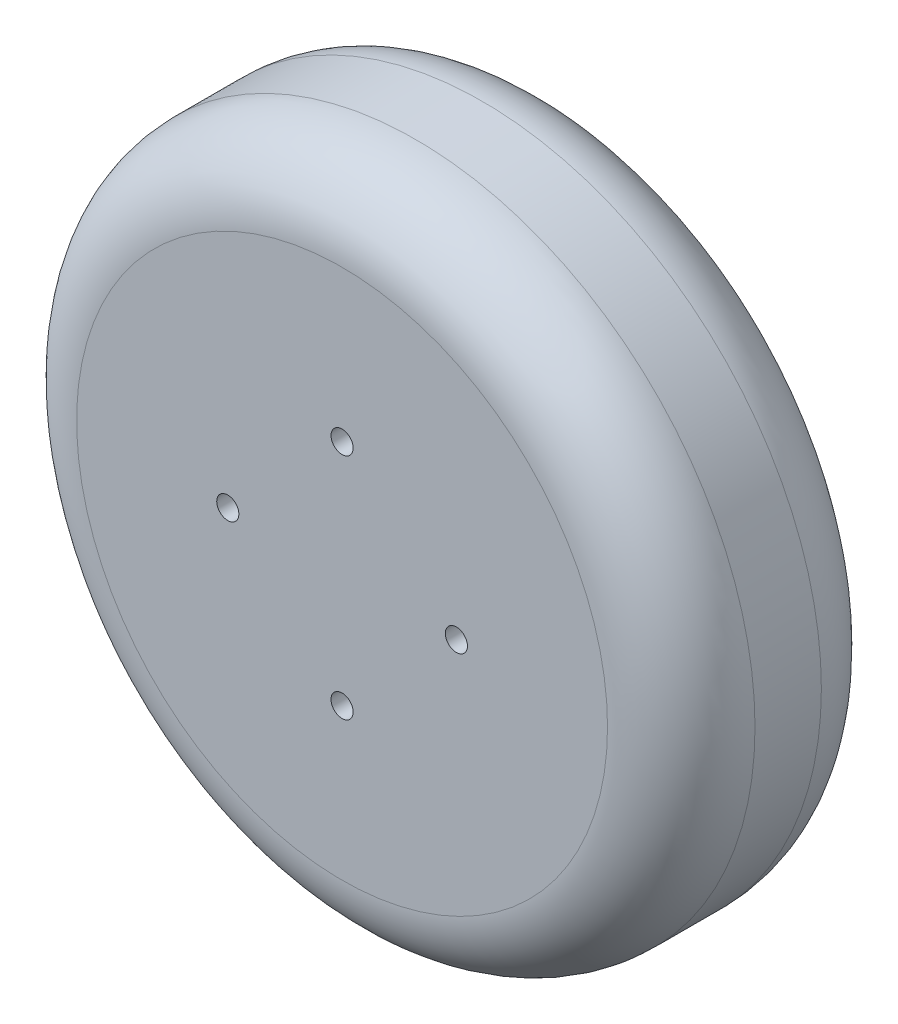
ISO-10303-21;
HEADER;
FILE_DESCRIPTION(('STEP AP214'),'2;1');
FILE_NAME('part.step','',(''),(''),'','','');
FILE_SCHEMA(('AUTOMOTIVE_DESIGN { 1 0 10303 214 1 1 1 1 }'));
ENDSEC;
DATA;
#1=APPLICATION_CONTEXT('core data for automotive mechanical design processes');
#2=APPLICATION_PROTOCOL_DEFINITION('international standard','automotive_design',2000,#1);
#3=PRODUCT_CONTEXT('',#1,'mechanical');
#4=PRODUCT('Part','Part','',(#3));
#5=PRODUCT_RELATED_PRODUCT_CATEGORY('part','',(#4));
#6=PRODUCT_DEFINITION_FORMATION('','',#4);
#7=PRODUCT_DEFINITION_CONTEXT('part definition',#1,'design');
#8=PRODUCT_DEFINITION('design','',#6,#7);
#9=PRODUCT_DEFINITION_SHAPE('','',#8);
#10=(LENGTH_UNIT() NAMED_UNIT(*) SI_UNIT(.MILLI.,.METRE.));
#11=(NAMED_UNIT(*) PLANE_ANGLE_UNIT() SI_UNIT($,.RADIAN.));
#12=(NAMED_UNIT(*) SI_UNIT($,.STERADIAN.) SOLID_ANGLE_UNIT());
#13=UNCERTAINTY_MEASURE_WITH_UNIT(LENGTH_MEASURE(1.E-05),#10,'distance_accuracy_value','');
#14=(GEOMETRIC_REPRESENTATION_CONTEXT(3) GLOBAL_UNCERTAINTY_ASSIGNED_CONTEXT((#13)) GLOBAL_UNIT_ASSIGNED_CONTEXT((#10,
#11,#12)) REPRESENTATION_CONTEXT('',''));
#15=CARTESIAN_POINT('',(0.,0.,0.));
#16=DIRECTION('',(0.,0.,1.));
#17=DIRECTION('',(1.,0.,0.));
#18=AXIS2_PLACEMENT_3D('',#15,#16,#17);
#19=CARTESIAN_POINT('',(0.,0.,29.));
#20=DIRECTION('',(0.,0.,1.));
#21=DIRECTION('',(1.,0.,0.));
#22=AXIS2_PLACEMENT_3D('',#19,#20,#21);
#23=PLANE('',#22);
#24=CARTESIAN_POINT('',(0.,0.,29.));
#25=DIRECTION('',(0.,0.,1.));
#26=DIRECTION('',(1.,0.,0.));
#27=AXIS2_PLACEMENT_3D('',#24,#25,#26);
#28=CIRCLE('',#27,36.);
#29=CARTESIAN_POINT('',(36.,0.,29.));
#30=VERTEX_POINT('',#29);
#31=EDGE_CURVE('E54',#30,#30,#28,.T.);
#32=ORIENTED_EDGE('',*,*,#31,.T.);
#33=EDGE_LOOP('',(#32));
#34=FACE_BOUND('',#33,.T.);
#35=CARTESIAN_POINT('',(1.08235921504137E-13,15.5,29.));
#36=DIRECTION('',(0.,0.,1.));
#37=DIRECTION('',(1.,0.,0.));
#38=AXIS2_PLACEMENT_3D('',#35,#36,#37);
#39=CIRCLE('',#38,1.5);
#40=CARTESIAN_POINT('',(-1.49999999999989,15.5,29.));
#41=VERTEX_POINT('',#40);
#42=EDGE_CURVE('E73',#41,#41,#39,.T.);
#43=ORIENTED_EDGE('',*,*,#42,.F.);
#44=EDGE_LOOP('',(#43));
#45=FACE_BOUND('',#44,.T.);
#46=CARTESIAN_POINT('',(0.,-15.5,29.));
#47=DIRECTION('',(0.,0.,1.));
#48=DIRECTION('',(1.,0.,0.));
#49=AXIS2_PLACEMENT_3D('',#46,#47,#48);
#50=CIRCLE('',#49,1.5);
#51=CARTESIAN_POINT('',(-1.5,-15.5,29.));
#52=VERTEX_POINT('',#51);
#53=EDGE_CURVE('E60',#52,#52,#50,.T.);
#54=ORIENTED_EDGE('',*,*,#53,.F.);
#55=EDGE_LOOP('',(#54));
#56=FACE_BOUND('',#55,.T.);
#57=CARTESIAN_POINT('',(-15.5,0.,29.));
#58=DIRECTION('',(0.,0.,1.));
#59=DIRECTION('',(1.,0.,0.));
#60=AXIS2_PLACEMENT_3D('',#57,#58,#59);
#61=CIRCLE('',#60,1.5);
#62=CARTESIAN_POINT('',(-17.,0.,29.));
#63=VERTEX_POINT('',#62);
#64=EDGE_CURVE('E65',#63,#63,#61,.T.);
#65=ORIENTED_EDGE('',*,*,#64,.F.);
#66=EDGE_LOOP('',(#65));
#67=FACE_BOUND('',#66,.T.);
#68=CARTESIAN_POINT('',(15.5,-1.62353882256206E-13,29.));
#69=DIRECTION('',(0.,0.,1.));
#70=DIRECTION('',(1.,0.,0.));
#71=AXIS2_PLACEMENT_3D('',#68,#69,#70);
#72=CIRCLE('',#71,1.5);
#73=CARTESIAN_POINT('',(14.,-1.62353882256206E-13,29.));
#74=VERTEX_POINT('',#73);
#75=EDGE_CURVE('E81',#74,#74,#72,.T.);
#76=ORIENTED_EDGE('',*,*,#75,.F.);
#77=EDGE_LOOP('',(#76));
#78=FACE_BOUND('',#77,.T.);
#79=ADVANCED_FACE('F36',(#34,#45,#56,#67,#78),#23,.T.);
#80=CARTESIAN_POINT('',(0.,0.,0.));
#81=DIRECTION('',(0.,0.,1.));
#82=DIRECTION('',(1.,0.,0.));
#83=AXIS2_PLACEMENT_3D('',#80,#81,#82);
#84=PLANE('',#83);
#85=CARTESIAN_POINT('',(0.,0.,0.));
#86=DIRECTION('',(0.,0.,1.));
#87=DIRECTION('',(1.,0.,0.));
#88=AXIS2_PLACEMENT_3D('',#85,#86,#87);
#89=CIRCLE('',#88,36.);
#90=CARTESIAN_POINT('',(36.,0.,0.));
#91=VERTEX_POINT('',#90);
#92=EDGE_CURVE('E10',#91,#91,#89,.F.);
#93=ORIENTED_EDGE('',*,*,#92,.T.);
#94=EDGE_LOOP('',(#93));
#95=FACE_BOUND('',#94,.T.);
#96=CARTESIAN_POINT('',(0.,-15.5,0.));
#97=DIRECTION('',(0.,0.,1.));
#98=DIRECTION('',(1.,0.,0.));
#99=AXIS2_PLACEMENT_3D('',#96,#97,#98);
#100=CIRCLE('',#99,1.5);
#101=CARTESIAN_POINT('',(-1.5,-15.5,0.));
#102=VERTEX_POINT('',#101);
#103=EDGE_CURVE('E61',#102,#102,#100,.T.);
#104=ORIENTED_EDGE('',*,*,#103,.T.);
#105=EDGE_LOOP('',(#104));
#106=FACE_BOUND('',#105,.T.);
#107=CARTESIAN_POINT('',(-15.5,0.,0.));
#108=DIRECTION('',(0.,0.,1.));
#109=DIRECTION('',(1.,0.,0.));
#110=AXIS2_PLACEMENT_3D('',#107,#108,#109);
#111=CIRCLE('',#110,1.5);
#112=CARTESIAN_POINT('',(-17.,0.,0.));
#113=VERTEX_POINT('',#112);
#114=EDGE_CURVE('E69',#113,#113,#111,.T.);
#115=ORIENTED_EDGE('',*,*,#114,.T.);
#116=EDGE_LOOP('',(#115));
#117=FACE_BOUND('',#116,.T.);
#118=CARTESIAN_POINT('',(1.08235921504137E-13,15.5,0.));
#119=DIRECTION('',(0.,0.,1.));
#120=DIRECTION('',(1.,0.,0.));
#121=AXIS2_PLACEMENT_3D('',#118,#119,#120);
#122=CIRCLE('',#121,1.5);
#123=CARTESIAN_POINT('',(-1.49999999999989,15.5,0.));
#124=VERTEX_POINT('',#123);
#125=EDGE_CURVE('E77',#124,#124,#122,.T.);
#126=ORIENTED_EDGE('',*,*,#125,.T.);
#127=EDGE_LOOP('',(#126));
#128=FACE_BOUND('',#127,.T.);
#129=CARTESIAN_POINT('',(15.5,-1.62353882256206E-13,0.));
#130=DIRECTION('',(0.,0.,1.));
#131=DIRECTION('',(1.,0.,0.));
#132=AXIS2_PLACEMENT_3D('',#129,#130,#131);
#133=CIRCLE('',#132,1.5);
#134=CARTESIAN_POINT('',(14.,-1.62353882256206E-13,0.));
#135=VERTEX_POINT('',#134);
#136=EDGE_CURVE('E85',#135,#135,#133,.T.);
#137=ORIENTED_EDGE('',*,*,#136,.T.);
#138=EDGE_LOOP('',(#137));
#139=FACE_BOUND('',#138,.T.);
#140=ADVANCED_FACE('F97',(#95,#106,#117,#128,#139),#84,.F.);
#141=CARTESIAN_POINT('',(0.,0.,29.));
#142=DIRECTION('',(0.,0.,-1.));
#143=DIRECTION('',(-1.,0.,0.));
#144=AXIS2_PLACEMENT_3D('',#141,#142,#143);
#145=CYLINDRICAL_SURFACE('',#144,46.);
#146=CARTESIAN_POINT('',(0.,0.,10.));
#147=DIRECTION('',(0.,0.,1.));
#148=DIRECTION('',(1.,0.,0.));
#149=AXIS2_PLACEMENT_3D('',#146,#147,#148);
#150=CIRCLE('',#149,46.);
#151=CARTESIAN_POINT('',(-46.,0.,9.99999999999999));
#152=VERTEX_POINT('',#151);
#153=EDGE_CURVE('E44',#152,#152,#150,.T.);
#154=CARTESIAN_POINT('',(0.,0.,19.));
#155=DIRECTION('',(0.,0.,1.));
#156=DIRECTION('',(1.,0.,0.));
#157=AXIS2_PLACEMENT_3D('',#154,#155,#156);
#158=CIRCLE('',#157,46.);
#159=CARTESIAN_POINT('',(-46.,0.,19.));
#160=VERTEX_POINT('',#159);
#161=EDGE_CURVE('E49',#160,#160,#158,.F.);
#162=CARTESIAN_POINT('',(-46.,0.,9.99999999999999));
#163=CARTESIAN_POINT('',(-46.,0.,10.09375));
#164=CARTESIAN_POINT('',(-46.,0.,10.1875));
#165=CARTESIAN_POINT('',(-46.,0.,10.375));
#166=CARTESIAN_POINT('',(-46.,0.,10.46875));
#167=CARTESIAN_POINT('',(-46.,0.,10.65625));
#168=CARTESIAN_POINT('',(-46.,0.,10.75));
#169=CARTESIAN_POINT('',(-46.,0.,10.9375));
#170=CARTESIAN_POINT('',(-46.,0.,11.03125));
#171=CARTESIAN_POINT('',(-46.,0.,11.21875));
#172=CARTESIAN_POINT('',(-46.,0.,11.3125));
#173=CARTESIAN_POINT('',(-46.,0.,11.5));
#174=CARTESIAN_POINT('',(-46.,0.,11.59375));
#175=CARTESIAN_POINT('',(-46.,0.,11.78125));
#176=CARTESIAN_POINT('',(-46.,0.,11.875));
#177=CARTESIAN_POINT('',(-46.,0.,12.0625));
#178=CARTESIAN_POINT('',(-46.,0.,12.15625));
#179=CARTESIAN_POINT('',(-46.,0.,12.34375));
#180=CARTESIAN_POINT('',(-46.,0.,12.4375));
#181=CARTESIAN_POINT('',(-46.,0.,12.625));
#182=CARTESIAN_POINT('',(-46.,0.,12.71875));
#183=CARTESIAN_POINT('',(-46.,0.,12.90625));
#184=CARTESIAN_POINT('',(-46.,0.,13.));
#185=CARTESIAN_POINT('',(-46.,0.,13.1875));
#186=CARTESIAN_POINT('',(-46.,0.,13.28125));
#187=CARTESIAN_POINT('',(-46.,0.,13.46875));
#188=CARTESIAN_POINT('',(-46.,0.,13.5625));
#189=CARTESIAN_POINT('',(-46.,0.,13.75));
#190=CARTESIAN_POINT('',(-46.,0.,13.84375));
#191=CARTESIAN_POINT('',(-46.,0.,14.03125));
#192=CARTESIAN_POINT('',(-46.,0.,14.125));
#193=CARTESIAN_POINT('',(-46.,0.,14.3125));
#194=CARTESIAN_POINT('',(-46.,0.,14.40625));
#195=CARTESIAN_POINT('',(-46.,0.,14.59375));
#196=CARTESIAN_POINT('',(-46.,0.,14.6875));
#197=CARTESIAN_POINT('',(-46.,0.,14.875));
#198=CARTESIAN_POINT('',(-46.,0.,14.96875));
#199=CARTESIAN_POINT('',(-46.,0.,15.15625));
#200=CARTESIAN_POINT('',(-46.,0.,15.25));
#201=CARTESIAN_POINT('',(-46.,0.,15.4375));
#202=CARTESIAN_POINT('',(-46.,0.,15.53125));
#203=CARTESIAN_POINT('',(-46.,0.,15.71875));
#204=CARTESIAN_POINT('',(-46.,0.,15.8125));
#205=CARTESIAN_POINT('',(-46.,0.,16.));
#206=CARTESIAN_POINT('',(-46.,0.,16.09375));
#207=CARTESIAN_POINT('',(-46.,0.,16.28125));
#208=CARTESIAN_POINT('',(-46.,0.,16.375));
#209=CARTESIAN_POINT('',(-46.,0.,16.5625));
#210=CARTESIAN_POINT('',(-46.,0.,16.65625));
#211=CARTESIAN_POINT('',(-46.,0.,16.84375));
#212=CARTESIAN_POINT('',(-46.,0.,16.9375));
#213=CARTESIAN_POINT('',(-46.,0.,17.125));
#214=CARTESIAN_POINT('',(-46.,0.,17.21875));
#215=CARTESIAN_POINT('',(-46.,0.,17.40625));
#216=CARTESIAN_POINT('',(-46.,0.,17.5));
#217=CARTESIAN_POINT('',(-46.,0.,17.6875));
#218=CARTESIAN_POINT('',(-46.,0.,17.78125));
#219=CARTESIAN_POINT('',(-46.,0.,17.96875));
#220=CARTESIAN_POINT('',(-46.,0.,18.0625));
#221=CARTESIAN_POINT('',(-46.,0.,18.25));
#222=CARTESIAN_POINT('',(-46.,0.,18.34375));
#223=CARTESIAN_POINT('',(-46.,0.,18.53125));
#224=CARTESIAN_POINT('',(-46.,0.,18.625));
#225=CARTESIAN_POINT('',(-46.,0.,18.8125));
#226=CARTESIAN_POINT('',(-46.,0.,18.90625));
#227=CARTESIAN_POINT('',(-46.,0.,19.));
#228=B_SPLINE_CURVE_WITH_KNOTS('',3,(#162,#163,#164,#165,#166,#167,#168,#169,#170,#171,#172,
#173,#174,#175,#176,#177,#178,#179,#180,#181,#182,#183,#184,#185,#186,#187,#188,#189,#190,#191,
#192,#193,#194,#195,#196,#197,#198,#199,#200,#201,#202,#203,#204,#205,#206,#207,#208,#209,#210,
#211,#212,#213,#214,#215,#216,#217,#218,#219,#220,#221,#222,#223,#224,#225,#226,#227),
.UNSPECIFIED.,.F.,.F.,(4,2,2,2,2,2,2,2,2,2,2,2,2,2,2,2,2,2,2,2,2,2,2,2,2,2,2,2,2,2,2,2,4),(0.,
0.28125,0.5625,0.843750000000001,1.125,1.40625,1.6875,1.96875,2.25,2.53125,2.8125,3.09375,3.375,
3.65625,3.9375,4.21875,4.5,4.78125,5.0625,5.34375,5.625,5.90625,6.18750000000001,6.46875,
6.75000000000001,7.03125,7.31250000000001,7.59375,7.87500000000001,8.15625,8.43750000000001,
8.71875,9.00000000000001),.UNSPECIFIED.);
#229=EDGE_CURVE('BSEAM105',#152,#160,#228,.T.);
#230=ORIENTED_EDGE('',*,*,#153,.T.);
#231=ORIENTED_EDGE('',*,*,#161,.T.);
#232=ORIENTED_EDGE('',*,*,#229,.T.);
#233=ORIENTED_EDGE('',*,*,#229,.F.);
#234=EDGE_LOOP('',(#230,#232,#231,#233));
#235=FACE_BOUND('',#234,.T.);
#236=ADVANCED_FACE('F105',(#235),#145,.T.);
#237=CARTESIAN_POINT('',(0.,-15.5,29.));
#238=DIRECTION('',(0.,0.,-1.));
#239=DIRECTION('',(-1.,0.,0.));
#240=AXIS2_PLACEMENT_3D('',#237,#238,#239);
#241=CYLINDRICAL_SURFACE('',#240,1.5);
#242=CARTESIAN_POINT('',(-1.5,-15.5,29.));
#243=CARTESIAN_POINT('',(-1.5,-15.5,28.6979166666667));
#244=CARTESIAN_POINT('',(-1.5,-15.5,28.3958333333333));
#245=CARTESIAN_POINT('',(-1.5,-15.5,27.7916666666667));
#246=CARTESIAN_POINT('',(-1.5,-15.5,27.4895833333333));
#247=CARTESIAN_POINT('',(-1.5,-15.5,26.8854166666667));
#248=CARTESIAN_POINT('',(-1.5,-15.5,26.5833333333333));
#249=CARTESIAN_POINT('',(-1.5,-15.5,25.9791666666667));
#250=CARTESIAN_POINT('',(-1.5,-15.5,25.6770833333333));
#251=CARTESIAN_POINT('',(-1.5,-15.5,25.0729166666667));
#252=CARTESIAN_POINT('',(-1.5,-15.5,24.7708333333333));
#253=CARTESIAN_POINT('',(-1.5,-15.5,24.1666666666667));
#254=CARTESIAN_POINT('',(-1.5,-15.5,23.8645833333333));
#255=CARTESIAN_POINT('',(-1.5,-15.5,23.2604166666667));
#256=CARTESIAN_POINT('',(-1.5,-15.5,22.9583333333333));
#257=CARTESIAN_POINT('',(-1.5,-15.5,22.3541666666667));
#258=CARTESIAN_POINT('',(-1.5,-15.5,22.0520833333333));
#259=CARTESIAN_POINT('',(-1.5,-15.5,21.4479166666667));
#260=CARTESIAN_POINT('',(-1.5,-15.5,21.1458333333333));
#261=CARTESIAN_POINT('',(-1.5,-15.5,20.5416666666667));
#262=CARTESIAN_POINT('',(-1.5,-15.5,20.2395833333333));
#263=CARTESIAN_POINT('',(-1.5,-15.5,19.6354166666667));
#264=CARTESIAN_POINT('',(-1.5,-15.5,19.3333333333333));
#265=CARTESIAN_POINT('',(-1.5,-15.5,18.7291666666667));
#266=CARTESIAN_POINT('',(-1.5,-15.5,18.4270833333333));
#267=CARTESIAN_POINT('',(-1.5,-15.5,17.8229166666667));
#268=CARTESIAN_POINT('',(-1.5,-15.5,17.5208333333333));
#269=CARTESIAN_POINT('',(-1.5,-15.5,16.9166666666667));
#270=CARTESIAN_POINT('',(-1.5,-15.5,16.6145833333333));
#271=CARTESIAN_POINT('',(-1.5,-15.5,16.0104166666667));
#272=CARTESIAN_POINT('',(-1.5,-15.5,15.7083333333333));
#273=CARTESIAN_POINT('',(-1.5,-15.5,15.1041666666667));
#274=CARTESIAN_POINT('',(-1.5,-15.5,14.8020833333333));
#275=CARTESIAN_POINT('',(-1.5,-15.5,14.1979166666667));
#276=CARTESIAN_POINT('',(-1.5,-15.5,13.8958333333333));
#277=CARTESIAN_POINT('',(-1.5,-15.5,13.2916666666667));
#278=CARTESIAN_POINT('',(-1.5,-15.5,12.9895833333333));
#279=CARTESIAN_POINT('',(-1.5,-15.5,12.3854166666667));
#280=CARTESIAN_POINT('',(-1.5,-15.5,12.0833333333333));
#281=CARTESIAN_POINT('',(-1.5,-15.5,11.4791666666667));
#282=CARTESIAN_POINT('',(-1.5,-15.5,11.1770833333333));
#283=CARTESIAN_POINT('',(-1.5,-15.5,10.5729166666667));
#284=CARTESIAN_POINT('',(-1.5,-15.5,10.2708333333333));
#285=CARTESIAN_POINT('',(-1.5,-15.5,9.66666666666667));
#286=CARTESIAN_POINT('',(-1.5,-15.5,9.36458333333333));
#287=CARTESIAN_POINT('',(-1.5,-15.5,8.76041666666667));
#288=CARTESIAN_POINT('',(-1.5,-15.5,8.45833333333333));
#289=CARTESIAN_POINT('',(-1.5,-15.5,7.85416666666667));
#290=CARTESIAN_POINT('',(-1.5,-15.5,7.55208333333333));
#291=CARTESIAN_POINT('',(-1.5,-15.5,6.94791666666667));
#292=CARTESIAN_POINT('',(-1.5,-15.5,6.64583333333333));
#293=CARTESIAN_POINT('',(-1.5,-15.5,6.04166666666667));
#294=CARTESIAN_POINT('',(-1.5,-15.5,5.73958333333333));
#295=CARTESIAN_POINT('',(-1.5,-15.5,5.13541666666667));
#296=CARTESIAN_POINT('',(-1.5,-15.5,4.83333333333333));
#297=CARTESIAN_POINT('',(-1.5,-15.5,4.22916666666667));
#298=CARTESIAN_POINT('',(-1.5,-15.5,3.92708333333333));
#299=CARTESIAN_POINT('',(-1.5,-15.5,3.32291666666667));
#300=CARTESIAN_POINT('',(-1.5,-15.5,3.02083333333333));
#301=CARTESIAN_POINT('',(-1.5,-15.5,2.41666666666667));
#302=CARTESIAN_POINT('',(-1.5,-15.5,2.11458333333333));
#303=CARTESIAN_POINT('',(-1.5,-15.5,1.51041666666667));
#304=CARTESIAN_POINT('',(-1.5,-15.5,1.20833333333333));
#305=CARTESIAN_POINT('',(-1.5,-15.5,0.604166666666667));
#306=CARTESIAN_POINT('',(-1.5,-15.5,0.302083333333333));
#307=CARTESIAN_POINT('',(-1.5,-15.5,0.));
#308=B_SPLINE_CURVE_WITH_KNOTS('',3,(#242,#243,#244,#245,#246,#247,#248,#249,#250,#251,#252,
#253,#254,#255,#256,#257,#258,#259,#260,#261,#262,#263,#264,#265,#266,#267,#268,#269,#270,#271,
#272,#273,#274,#275,#276,#277,#278,#279,#280,#281,#282,#283,#284,#285,#286,#287,#288,#289,#290,
#291,#292,#293,#294,#295,#296,#297,#298,#299,#300,#301,#302,#303,#304,#305,#306,#307),
.UNSPECIFIED.,.F.,.F.,(4,2,2,2,2,2,2,2,2,2,2,2,2,2,2,2,2,2,2,2,2,2,2,2,2,2,2,2,2,2,2,2,4),(0.,
0.906250000000001,1.8125,2.71875,3.625,4.53125,5.4375,6.34375,7.25,8.15625,9.0625,9.96875,
10.875,11.78125,12.6875,13.59375,14.5,15.40625,16.3125,17.21875,18.125,19.03125,19.9375,
20.84375,21.75,22.65625,23.5625,24.46875,25.375,26.28125,27.1875,28.09375,29.),.UNSPECIFIED.);
#309=EDGE_CURVE('BSEAM109',#52,#102,#308,.T.);
#310=ORIENTED_EDGE('',*,*,#53,.T.);
#311=ORIENTED_EDGE('',*,*,#103,.F.);
#312=ORIENTED_EDGE('',*,*,#309,.T.);
#313=ORIENTED_EDGE('',*,*,#309,.F.);
#314=EDGE_LOOP('',(#310,#312,#311,#313));
#315=FACE_BOUND('',#314,.T.);
#316=ADVANCED_FACE('F109',(#315),#241,.F.);
#317=CARTESIAN_POINT('',(-15.5,0.,29.));
#318=DIRECTION('',(0.,0.,-1.));
#319=DIRECTION('',(-1.,0.,0.));
#320=AXIS2_PLACEMENT_3D('',#317,#318,#319);
#321=CYLINDRICAL_SURFACE('',#320,1.5);
#322=CARTESIAN_POINT('',(-17.,0.,29.));
#323=CARTESIAN_POINT('',(-17.,0.,28.6979166666667));
#324=CARTESIAN_POINT('',(-17.,0.,28.3958333333333));
#325=CARTESIAN_POINT('',(-17.,0.,27.7916666666667));
#326=CARTESIAN_POINT('',(-17.,0.,27.4895833333333));
#327=CARTESIAN_POINT('',(-17.,0.,26.8854166666667));
#328=CARTESIAN_POINT('',(-17.,0.,26.5833333333333));
#329=CARTESIAN_POINT('',(-17.,0.,25.9791666666667));
#330=CARTESIAN_POINT('',(-17.,0.,25.6770833333333));
#331=CARTESIAN_POINT('',(-17.,0.,25.0729166666667));
#332=CARTESIAN_POINT('',(-17.,0.,24.7708333333333));
#333=CARTESIAN_POINT('',(-17.,0.,24.1666666666667));
#334=CARTESIAN_POINT('',(-17.,0.,23.8645833333333));
#335=CARTESIAN_POINT('',(-17.,0.,23.2604166666667));
#336=CARTESIAN_POINT('',(-17.,0.,22.9583333333333));
#337=CARTESIAN_POINT('',(-17.,0.,22.3541666666667));
#338=CARTESIAN_POINT('',(-17.,0.,22.0520833333333));
#339=CARTESIAN_POINT('',(-17.,0.,21.4479166666667));
#340=CARTESIAN_POINT('',(-17.,0.,21.1458333333333));
#341=CARTESIAN_POINT('',(-17.,0.,20.5416666666667));
#342=CARTESIAN_POINT('',(-17.,0.,20.2395833333333));
#343=CARTESIAN_POINT('',(-17.,0.,19.6354166666667));
#344=CARTESIAN_POINT('',(-17.,0.,19.3333333333333));
#345=CARTESIAN_POINT('',(-17.,0.,18.7291666666667));
#346=CARTESIAN_POINT('',(-17.,0.,18.4270833333333));
#347=CARTESIAN_POINT('',(-17.,0.,17.8229166666667));
#348=CARTESIAN_POINT('',(-17.,0.,17.5208333333333));
#349=CARTESIAN_POINT('',(-17.,0.,16.9166666666667));
#350=CARTESIAN_POINT('',(-17.,0.,16.6145833333333));
#351=CARTESIAN_POINT('',(-17.,0.,16.0104166666667));
#352=CARTESIAN_POINT('',(-17.,0.,15.7083333333333));
#353=CARTESIAN_POINT('',(-17.,0.,15.1041666666667));
#354=CARTESIAN_POINT('',(-17.,0.,14.8020833333333));
#355=CARTESIAN_POINT('',(-17.,0.,14.1979166666667));
#356=CARTESIAN_POINT('',(-17.,0.,13.8958333333333));
#357=CARTESIAN_POINT('',(-17.,0.,13.2916666666667));
#358=CARTESIAN_POINT('',(-17.,0.,12.9895833333333));
#359=CARTESIAN_POINT('',(-17.,0.,12.3854166666667));
#360=CARTESIAN_POINT('',(-17.,0.,12.0833333333333));
#361=CARTESIAN_POINT('',(-17.,0.,11.4791666666667));
#362=CARTESIAN_POINT('',(-17.,0.,11.1770833333333));
#363=CARTESIAN_POINT('',(-17.,0.,10.5729166666667));
#364=CARTESIAN_POINT('',(-17.,0.,10.2708333333333));
#365=CARTESIAN_POINT('',(-17.,0.,9.66666666666667));
#366=CARTESIAN_POINT('',(-17.,0.,9.36458333333333));
#367=CARTESIAN_POINT('',(-17.,0.,8.76041666666667));
#368=CARTESIAN_POINT('',(-17.,0.,8.45833333333333));
#369=CARTESIAN_POINT('',(-17.,0.,7.85416666666667));
#370=CARTESIAN_POINT('',(-17.,0.,7.55208333333333));
#371=CARTESIAN_POINT('',(-17.,0.,6.94791666666667));
#372=CARTESIAN_POINT('',(-17.,0.,6.64583333333333));
#373=CARTESIAN_POINT('',(-17.,0.,6.04166666666667));
#374=CARTESIAN_POINT('',(-17.,0.,5.73958333333333));
#375=CARTESIAN_POINT('',(-17.,0.,5.13541666666667));
#376=CARTESIAN_POINT('',(-17.,0.,4.83333333333333));
#377=CARTESIAN_POINT('',(-17.,0.,4.22916666666667));
#378=CARTESIAN_POINT('',(-17.,0.,3.92708333333333));
#379=CARTESIAN_POINT('',(-17.,0.,3.32291666666667));
#380=CARTESIAN_POINT('',(-17.,0.,3.02083333333333));
#381=CARTESIAN_POINT('',(-17.,0.,2.41666666666667));
#382=CARTESIAN_POINT('',(-17.,0.,2.11458333333333));
#383=CARTESIAN_POINT('',(-17.,0.,1.51041666666667));
#384=CARTESIAN_POINT('',(-17.,0.,1.20833333333333));
#385=CARTESIAN_POINT('',(-17.,0.,0.604166666666667));
#386=CARTESIAN_POINT('',(-17.,0.,0.302083333333333));
#387=CARTESIAN_POINT('',(-17.,0.,0.));
#388=B_SPLINE_CURVE_WITH_KNOTS('',3,(#322,#323,#324,#325,#326,#327,#328,#329,#330,#331,#332,
#333,#334,#335,#336,#337,#338,#339,#340,#341,#342,#343,#344,#345,#346,#347,#348,#349,#350,#351,
#352,#353,#354,#355,#356,#357,#358,#359,#360,#361,#362,#363,#364,#365,#366,#367,#368,#369,#370,
#371,#372,#373,#374,#375,#376,#377,#378,#379,#380,#381,#382,#383,#384,#385,#386,#387),
.UNSPECIFIED.,.F.,.F.,(4,2,2,2,2,2,2,2,2,2,2,2,2,2,2,2,2,2,2,2,2,2,2,2,2,2,2,2,2,2,2,2,4),(0.,
0.906250000000001,1.8125,2.71875,3.625,4.53125,5.4375,6.34375,7.25,8.15625,9.0625,9.96875,
10.875,11.78125,12.6875,13.59375,14.5,15.40625,16.3125,17.21875,18.125,19.03125,19.9375,
20.84375,21.75,22.65625,23.5625,24.46875,25.375,26.28125,27.1875,28.09375,29.),.UNSPECIFIED.);
#389=EDGE_CURVE('BSEAM128',#63,#113,#388,.T.);
#390=ORIENTED_EDGE('',*,*,#64,.T.);
#391=ORIENTED_EDGE('',*,*,#114,.F.);
#392=ORIENTED_EDGE('',*,*,#389,.T.);
#393=ORIENTED_EDGE('',*,*,#389,.F.);
#394=EDGE_LOOP('',(#390,#392,#391,#393));
#395=FACE_BOUND('',#394,.T.);
#396=ADVANCED_FACE('F128',(#395),#321,.F.);
#397=CARTESIAN_POINT('',(1.08235921504137E-13,15.5,29.));
#398=DIRECTION('',(0.,0.,-1.));
#399=DIRECTION('',(-1.,0.,0.));
#400=AXIS2_PLACEMENT_3D('',#397,#398,#399);
#401=CYLINDRICAL_SURFACE('',#400,1.5);
#402=CARTESIAN_POINT('',(-1.49999999999989,15.5,29.));
#403=CARTESIAN_POINT('',(-1.49999999999989,15.5,28.6979166666667));
#404=CARTESIAN_POINT('',(-1.49999999999989,15.5,28.3958333333333));
#405=CARTESIAN_POINT('',(-1.49999999999989,15.5,27.7916666666667));
#406=CARTESIAN_POINT('',(-1.49999999999989,15.5,27.4895833333333));
#407=CARTESIAN_POINT('',(-1.49999999999989,15.5,26.8854166666667));
#408=CARTESIAN_POINT('',(-1.49999999999989,15.5,26.5833333333333));
#409=CARTESIAN_POINT('',(-1.49999999999989,15.5,25.9791666666667));
#410=CARTESIAN_POINT('',(-1.49999999999989,15.5,25.6770833333333));
#411=CARTESIAN_POINT('',(-1.49999999999989,15.5,25.0729166666667));
#412=CARTESIAN_POINT('',(-1.49999999999989,15.5,24.7708333333333));
#413=CARTESIAN_POINT('',(-1.49999999999989,15.5,24.1666666666667));
#414=CARTESIAN_POINT('',(-1.49999999999989,15.5,23.8645833333333));
#415=CARTESIAN_POINT('',(-1.49999999999989,15.5,23.2604166666667));
#416=CARTESIAN_POINT('',(-1.49999999999989,15.5,22.9583333333333));
#417=CARTESIAN_POINT('',(-1.49999999999989,15.5,22.3541666666667));
#418=CARTESIAN_POINT('',(-1.49999999999989,15.5,22.0520833333333));
#419=CARTESIAN_POINT('',(-1.49999999999989,15.5,21.4479166666667));
#420=CARTESIAN_POINT('',(-1.49999999999989,15.5,21.1458333333333));
#421=CARTESIAN_POINT('',(-1.49999999999989,15.5,20.5416666666667));
#422=CARTESIAN_POINT('',(-1.49999999999989,15.5,20.2395833333333));
#423=CARTESIAN_POINT('',(-1.49999999999989,15.5,19.6354166666667));
#424=CARTESIAN_POINT('',(-1.49999999999989,15.5,19.3333333333333));
#425=CARTESIAN_POINT('',(-1.49999999999989,15.5,18.7291666666667));
#426=CARTESIAN_POINT('',(-1.49999999999989,15.5,18.4270833333333));
#427=CARTESIAN_POINT('',(-1.49999999999989,15.5,17.8229166666667));
#428=CARTESIAN_POINT('',(-1.49999999999989,15.5,17.5208333333333));
#429=CARTESIAN_POINT('',(-1.49999999999989,15.5,16.9166666666667));
#430=CARTESIAN_POINT('',(-1.49999999999989,15.5,16.6145833333333));
#431=CARTESIAN_POINT('',(-1.49999999999989,15.5,16.0104166666667));
#432=CARTESIAN_POINT('',(-1.49999999999989,15.5,15.7083333333333));
#433=CARTESIAN_POINT('',(-1.49999999999989,15.5,15.1041666666667));
#434=CARTESIAN_POINT('',(-1.49999999999989,15.5,14.8020833333333));
#435=CARTESIAN_POINT('',(-1.49999999999989,15.5,14.1979166666667));
#436=CARTESIAN_POINT('',(-1.49999999999989,15.5,13.8958333333333));
#437=CARTESIAN_POINT('',(-1.49999999999989,15.5,13.2916666666667));
#438=CARTESIAN_POINT('',(-1.49999999999989,15.5,12.9895833333333));
#439=CARTESIAN_POINT('',(-1.49999999999989,15.5,12.3854166666667));
#440=CARTESIAN_POINT('',(-1.49999999999989,15.5,12.0833333333333));
#441=CARTESIAN_POINT('',(-1.49999999999989,15.5,11.4791666666667));
#442=CARTESIAN_POINT('',(-1.49999999999989,15.5,11.1770833333333));
#443=CARTESIAN_POINT('',(-1.49999999999989,15.5,10.5729166666667));
#444=CARTESIAN_POINT('',(-1.49999999999989,15.5,10.2708333333333));
#445=CARTESIAN_POINT('',(-1.49999999999989,15.5,9.66666666666667));
#446=CARTESIAN_POINT('',(-1.49999999999989,15.5,9.36458333333333));
#447=CARTESIAN_POINT('',(-1.49999999999989,15.5,8.76041666666667));
#448=CARTESIAN_POINT('',(-1.49999999999989,15.5,8.45833333333333));
#449=CARTESIAN_POINT('',(-1.49999999999989,15.5,7.85416666666667));
#450=CARTESIAN_POINT('',(-1.49999999999989,15.5,7.55208333333333));
#451=CARTESIAN_POINT('',(-1.49999999999989,15.5,6.94791666666667));
#452=CARTESIAN_POINT('',(-1.49999999999989,15.5,6.64583333333333));
#453=CARTESIAN_POINT('',(-1.49999999999989,15.5,6.04166666666667));
#454=CARTESIAN_POINT('',(-1.49999999999989,15.5,5.73958333333333));
#455=CARTESIAN_POINT('',(-1.49999999999989,15.5,5.13541666666667));
#456=CARTESIAN_POINT('',(-1.49999999999989,15.5,4.83333333333333));
#457=CARTESIAN_POINT('',(-1.49999999999989,15.5,4.22916666666667));
#458=CARTESIAN_POINT('',(-1.49999999999989,15.5,3.92708333333333));
#459=CARTESIAN_POINT('',(-1.49999999999989,15.5,3.32291666666667));
#460=CARTESIAN_POINT('',(-1.49999999999989,15.5,3.02083333333333));
#461=CARTESIAN_POINT('',(-1.49999999999989,15.5,2.41666666666667));
#462=CARTESIAN_POINT('',(-1.49999999999989,15.5,2.11458333333333));
#463=CARTESIAN_POINT('',(-1.49999999999989,15.5,1.51041666666667));
#464=CARTESIAN_POINT('',(-1.49999999999989,15.5,1.20833333333333));
#465=CARTESIAN_POINT('',(-1.49999999999989,15.5,0.604166666666667));
#466=CARTESIAN_POINT('',(-1.49999999999989,15.5,0.302083333333333));
#467=CARTESIAN_POINT('',(-1.49999999999989,15.5,0.));
#468=B_SPLINE_CURVE_WITH_KNOTS('',3,(#402,#403,#404,#405,#406,#407,#408,#409,#410,#411,#412,
#413,#414,#415,#416,#417,#418,#419,#420,#421,#422,#423,#424,#425,#426,#427,#428,#429,#430,#431,
#432,#433,#434,#435,#436,#437,#438,#439,#440,#441,#442,#443,#444,#445,#446,#447,#448,#449,#450,
#451,#452,#453,#454,#455,#456,#457,#458,#459,#460,#461,#462,#463,#464,#465,#466,#467),
.UNSPECIFIED.,.F.,.F.,(4,2,2,2,2,2,2,2,2,2,2,2,2,2,2,2,2,2,2,2,2,2,2,2,2,2,2,2,2,2,2,2,4),(0.,
0.906250000000001,1.8125,2.71875,3.625,4.53125,5.4375,6.34375,7.25,8.15625,9.0625,9.96875,
10.875,11.78125,12.6875,13.59375,14.5,15.40625,16.3125,17.21875,18.125,19.03125,19.9375,
20.84375,21.75,22.65625,23.5625,24.46875,25.375,26.28125,27.1875,28.09375,29.),.UNSPECIFIED.);
#469=EDGE_CURVE('BSEAM120',#41,#124,#468,.T.);
#470=ORIENTED_EDGE('',*,*,#42,.T.);
#471=ORIENTED_EDGE('',*,*,#125,.F.);
#472=ORIENTED_EDGE('',*,*,#469,.T.);
#473=ORIENTED_EDGE('',*,*,#469,.F.);
#474=EDGE_LOOP('',(#470,#472,#471,#473));
#475=FACE_BOUND('',#474,.T.);
#476=ADVANCED_FACE('F120',(#475),#401,.F.);
#477=CARTESIAN_POINT('',(15.5,-1.62353882256206E-13,29.));
#478=DIRECTION('',(0.,0.,-1.));
#479=DIRECTION('',(-1.,0.,0.));
#480=AXIS2_PLACEMENT_3D('',#477,#478,#479);
#481=CYLINDRICAL_SURFACE('',#480,1.5);
#482=CARTESIAN_POINT('',(14.,-1.62353882256206E-13,29.));
#483=CARTESIAN_POINT('',(14.,-1.62353882256206E-13,28.6979166666667));
#484=CARTESIAN_POINT('',(14.,-1.62353882256206E-13,28.3958333333333));
#485=CARTESIAN_POINT('',(14.,-1.62353882256206E-13,27.7916666666667));
#486=CARTESIAN_POINT('',(14.,-1.62353882256206E-13,27.4895833333333));
#487=CARTESIAN_POINT('',(14.,-1.62353882256206E-13,26.8854166666667));
#488=CARTESIAN_POINT('',(14.,-1.62353882256206E-13,26.5833333333333));
#489=CARTESIAN_POINT('',(14.,-1.62353882256206E-13,25.9791666666667));
#490=CARTESIAN_POINT('',(14.,-1.62353882256206E-13,25.6770833333333));
#491=CARTESIAN_POINT('',(14.,-1.62353882256206E-13,25.0729166666667));
#492=CARTESIAN_POINT('',(14.,-1.62353882256206E-13,24.7708333333333));
#493=CARTESIAN_POINT('',(14.,-1.62353882256206E-13,24.1666666666667));
#494=CARTESIAN_POINT('',(14.,-1.62353882256206E-13,23.8645833333333));
#495=CARTESIAN_POINT('',(14.,-1.62353882256206E-13,23.2604166666667));
#496=CARTESIAN_POINT('',(14.,-1.62353882256206E-13,22.9583333333333));
#497=CARTESIAN_POINT('',(14.,-1.62353882256206E-13,22.3541666666667));
#498=CARTESIAN_POINT('',(14.,-1.62353882256206E-13,22.0520833333333));
#499=CARTESIAN_POINT('',(14.,-1.62353882256206E-13,21.4479166666667));
#500=CARTESIAN_POINT('',(14.,-1.62353882256206E-13,21.1458333333333));
#501=CARTESIAN_POINT('',(14.,-1.62353882256206E-13,20.5416666666667));
#502=CARTESIAN_POINT('',(14.,-1.62353882256206E-13,20.2395833333333));
#503=CARTESIAN_POINT('',(14.,-1.62353882256206E-13,19.6354166666667));
#504=CARTESIAN_POINT('',(14.,-1.62353882256206E-13,19.3333333333333));
#505=CARTESIAN_POINT('',(14.,-1.62353882256206E-13,18.7291666666667));
#506=CARTESIAN_POINT('',(14.,-1.62353882256206E-13,18.4270833333333));
#507=CARTESIAN_POINT('',(14.,-1.62353882256206E-13,17.8229166666667));
#508=CARTESIAN_POINT('',(14.,-1.62353882256206E-13,17.5208333333333));
#509=CARTESIAN_POINT('',(14.,-1.62353882256206E-13,16.9166666666667));
#510=CARTESIAN_POINT('',(14.,-1.62353882256206E-13,16.6145833333333));
#511=CARTESIAN_POINT('',(14.,-1.62353882256206E-13,16.0104166666667));
#512=CARTESIAN_POINT('',(14.,-1.62353882256206E-13,15.7083333333333));
#513=CARTESIAN_POINT('',(14.,-1.62353882256206E-13,15.1041666666667));
#514=CARTESIAN_POINT('',(14.,-1.62353882256206E-13,14.8020833333333));
#515=CARTESIAN_POINT('',(14.,-1.62353882256206E-13,14.1979166666667));
#516=CARTESIAN_POINT('',(14.,-1.62353882256206E-13,13.8958333333333));
#517=CARTESIAN_POINT('',(14.,-1.62353882256206E-13,13.2916666666667));
#518=CARTESIAN_POINT('',(14.,-1.62353882256206E-13,12.9895833333333));
#519=CARTESIAN_POINT('',(14.,-1.62353882256206E-13,12.3854166666667));
#520=CARTESIAN_POINT('',(14.,-1.62353882256206E-13,12.0833333333333));
#521=CARTESIAN_POINT('',(14.,-1.62353882256206E-13,11.4791666666667));
#522=CARTESIAN_POINT('',(14.,-1.62353882256206E-13,11.1770833333333));
#523=CARTESIAN_POINT('',(14.,-1.62353882256206E-13,10.5729166666667));
#524=CARTESIAN_POINT('',(14.,-1.62353882256206E-13,10.2708333333333));
#525=CARTESIAN_POINT('',(14.,-1.62353882256206E-13,9.66666666666667));
#526=CARTESIAN_POINT('',(14.,-1.62353882256206E-13,9.36458333333333));
#527=CARTESIAN_POINT('',(14.,-1.62353882256206E-13,8.76041666666667));
#528=CARTESIAN_POINT('',(14.,-1.62353882256206E-13,8.45833333333333));
#529=CARTESIAN_POINT('',(14.,-1.62353882256206E-13,7.85416666666667));
#530=CARTESIAN_POINT('',(14.,-1.62353882256206E-13,7.55208333333333));
#531=CARTESIAN_POINT('',(14.,-1.62353882256206E-13,6.94791666666667));
#532=CARTESIAN_POINT('',(14.,-1.62353882256206E-13,6.64583333333333));
#533=CARTESIAN_POINT('',(14.,-1.62353882256206E-13,6.04166666666667));
#534=CARTESIAN_POINT('',(14.,-1.62353882256206E-13,5.73958333333333));
#535=CARTESIAN_POINT('',(14.,-1.62353882256206E-13,5.13541666666667));
#536=CARTESIAN_POINT('',(14.,-1.62353882256206E-13,4.83333333333333));
#537=CARTESIAN_POINT('',(14.,-1.62353882256206E-13,4.22916666666667));
#538=CARTESIAN_POINT('',(14.,-1.62353882256206E-13,3.92708333333333));
#539=CARTESIAN_POINT('',(14.,-1.62353882256206E-13,3.32291666666667));
#540=CARTESIAN_POINT('',(14.,-1.62353882256206E-13,3.02083333333333));
#541=CARTESIAN_POINT('',(14.,-1.62353882256206E-13,2.41666666666667));
#542=CARTESIAN_POINT('',(14.,-1.62353882256206E-13,2.11458333333333));
#543=CARTESIAN_POINT('',(14.,-1.62353882256206E-13,1.51041666666667));
#544=CARTESIAN_POINT('',(14.,-1.62353882256206E-13,1.20833333333333));
#545=CARTESIAN_POINT('',(14.,-1.62353882256206E-13,0.604166666666667));
#546=CARTESIAN_POINT('',(14.,-1.62353882256206E-13,0.302083333333333));
#547=CARTESIAN_POINT('',(14.,-1.62353882256206E-13,0.));
#548=B_SPLINE_CURVE_WITH_KNOTS('',3,(#482,#483,#484,#485,#486,#487,#488,#489,#490,#491,#492,
#493,#494,#495,#496,#497,#498,#499,#500,#501,#502,#503,#504,#505,#506,#507,#508,#509,#510,#511,
#512,#513,#514,#515,#516,#517,#518,#519,#520,#521,#522,#523,#524,#525,#526,#527,#528,#529,#530,
#531,#532,#533,#534,#535,#536,#537,#538,#539,#540,#541,#542,#543,#544,#545,#546,#547),
.UNSPECIFIED.,.F.,.F.,(4,2,2,2,2,2,2,2,2,2,2,2,2,2,2,2,2,2,2,2,2,2,2,2,2,2,2,2,2,2,2,2,4),(0.,
0.906250000000001,1.8125,2.71875,3.625,4.53125,5.4375,6.34375,7.25,8.15625,9.0625,9.96875,
10.875,11.78125,12.6875,13.59375,14.5,15.40625,16.3125,17.21875,18.125,19.03125,19.9375,
20.84375,21.75,22.65625,23.5625,24.46875,25.375,26.28125,27.1875,28.09375,29.),.UNSPECIFIED.);
#549=EDGE_CURVE('BSEAM93',#74,#135,#548,.T.);
#550=ORIENTED_EDGE('',*,*,#75,.T.);
#551=ORIENTED_EDGE('',*,*,#136,.F.);
#552=ORIENTED_EDGE('',*,*,#549,.T.);
#553=ORIENTED_EDGE('',*,*,#549,.F.);
#554=EDGE_LOOP('',(#550,#552,#551,#553));
#555=FACE_BOUND('',#554,.T.);
#556=ADVANCED_FACE('F93',(#555),#481,.F.);
#557=CARTESIAN_POINT('',(0.,0.,19.));
#558=DIRECTION('',(0.,0.,1.));
#559=DIRECTION('',(1.,0.,0.));
#560=AXIS2_PLACEMENT_3D('',#557,#558,#559);
#561=TOROIDAL_SURFACE('',#560,36.,10.);
#562=ORIENTED_EDGE('',*,*,#161,.F.);
#563=EDGE_LOOP('',(#562));
#564=FACE_BOUND('',#563,.T.);
#565=ORIENTED_EDGE('',*,*,#31,.F.);
#566=EDGE_LOOP('',(#565));
#567=FACE_BOUND('',#566,.T.);
#568=ADVANCED_FACE('F113',(#564,#567),#561,.T.);
#569=CARTESIAN_POINT('',(0.,0.,10.));
#570=DIRECTION('',(0.,0.,1.));
#571=DIRECTION('',(1.,0.,0.));
#572=AXIS2_PLACEMENT_3D('',#569,#570,#571);
#573=TOROIDAL_SURFACE('',#572,36.,10.);
#574=ORIENTED_EDGE('',*,*,#92,.F.);
#575=EDGE_LOOP('',(#574));
#576=FACE_BOUND('',#575,.T.);
#577=ORIENTED_EDGE('',*,*,#153,.F.);
#578=EDGE_LOOP('',(#577));
#579=FACE_BOUND('',#578,.T.);
#580=ADVANCED_FACE('F38',(#576,#579),#573,.T.);
#581=CLOSED_SHELL('',(#79,#140,#236,#316,#396,#476,#556,#568,#580));
#582=MANIFOLD_SOLID_BREP('B2',#581);
#583=ADVANCED_BREP_SHAPE_REPRESENTATION('',(#18,#582),#14);
#584=SHAPE_DEFINITION_REPRESENTATION(#9,#583);
ENDSEC;
END-ISO-10303-21;
